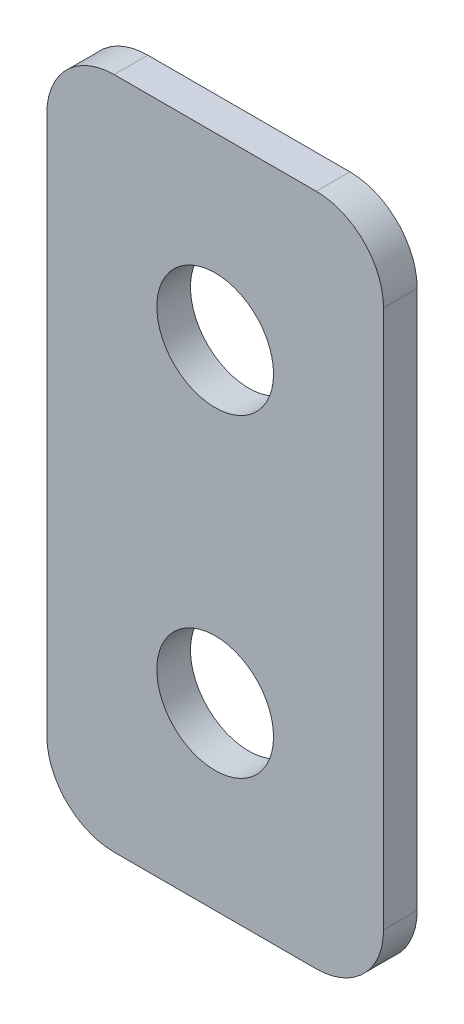
ISO-10303-21;
HEADER;
FILE_DESCRIPTION(('STEP AP214'),'2;1');
FILE_NAME('part.step','',(''),(''),'','','');
FILE_SCHEMA(('AUTOMOTIVE_DESIGN { 1 0 10303 214 1 1 1 1 }'));
ENDSEC;
DATA;
#1=APPLICATION_CONTEXT('core data for automotive mechanical design processes');
#2=APPLICATION_PROTOCOL_DEFINITION('international standard','automotive_design',2000,#1);
#3=PRODUCT_CONTEXT('',#1,'mechanical');
#4=PRODUCT('Part','Part','',(#3));
#5=PRODUCT_RELATED_PRODUCT_CATEGORY('part','',(#4));
#6=PRODUCT_DEFINITION_FORMATION('','',#4);
#7=PRODUCT_DEFINITION_CONTEXT('part definition',#1,'design');
#8=PRODUCT_DEFINITION('design','',#6,#7);
#9=PRODUCT_DEFINITION_SHAPE('','',#8);
#10=(LENGTH_UNIT() NAMED_UNIT(*) SI_UNIT(.MILLI.,.METRE.));
#11=(NAMED_UNIT(*) PLANE_ANGLE_UNIT() SI_UNIT($,.RADIAN.));
#12=(NAMED_UNIT(*) SI_UNIT($,.STERADIAN.) SOLID_ANGLE_UNIT());
#13=UNCERTAINTY_MEASURE_WITH_UNIT(LENGTH_MEASURE(1.E-05),#10,'distance_accuracy_value','');
#14=(GEOMETRIC_REPRESENTATION_CONTEXT(3) GLOBAL_UNCERTAINTY_ASSIGNED_CONTEXT((#13)) GLOBAL_UNIT_ASSIGNED_CONTEXT((#10,
#11,#12)) REPRESENTATION_CONTEXT('',''));
#15=CARTESIAN_POINT('',(0.,0.,0.));
#16=DIRECTION('',(0.,0.,1.));
#17=DIRECTION('',(1.,0.,0.));
#18=AXIS2_PLACEMENT_3D('',#15,#16,#17);
#19=CARTESIAN_POINT('',(12.,27.,0.));
#20=DIRECTION('',(0.,0.,1.));
#21=DIRECTION('',(1.,0.,0.));
#22=AXIS2_PLACEMENT_3D('',#19,#20,#21);
#23=CYLINDRICAL_SURFACE('',#22,3.);
#24=DIRECTION('',(0.,0.,1.));
#25=VECTOR('',#24,1.);
#26=CARTESIAN_POINT('',(15.,27.,0.));
#27=LINE('',#26,#25);
#28=CARTESIAN_POINT('',(15.,27.,-1.5));
#29=VERTEX_POINT('',#28);
#30=CARTESIAN_POINT('',(15.,27.,0.));
#31=VERTEX_POINT('',#30);
#32=EDGE_CURVE('E11',#29,#31,#27,.T.);
#33=ORIENTED_EDGE('',*,*,#32,.F.);
#34=CARTESIAN_POINT('',(12.,27.,-1.5));
#35=DIRECTION('',(0.,0.,1.));
#36=DIRECTION('',(1.,0.,0.));
#37=AXIS2_PLACEMENT_3D('',#34,#35,#36);
#38=CIRCLE('',#37,3.);
#39=CARTESIAN_POINT('',(12.,30.,-1.5));
#40=VERTEX_POINT('',#39);
#41=EDGE_CURVE('E107',#29,#40,#38,.T.);
#42=ORIENTED_EDGE('',*,*,#41,.T.);
#43=DIRECTION('',(0.,0.,1.));
#44=VECTOR('',#43,1.);
#45=CARTESIAN_POINT('',(12.,30.,0.));
#46=LINE('',#45,#44);
#47=CARTESIAN_POINT('',(12.,30.,0.));
#48=VERTEX_POINT('',#47);
#49=EDGE_CURVE('E50',#40,#48,#46,.T.);
#50=ORIENTED_EDGE('',*,*,#49,.T.);
#51=CARTESIAN_POINT('',(12.,27.,0.));
#52=DIRECTION('',(0.,0.,1.));
#53=DIRECTION('',(-1.,0.,0.));
#54=AXIS2_PLACEMENT_3D('',#51,#52,#53);
#55=CIRCLE('',#54,3.);
#56=EDGE_CURVE('E160',#31,#48,#55,.T.);
#57=ORIENTED_EDGE('',*,*,#56,.F.);
#58=EDGE_LOOP('',(#33,#42,#50,#57));
#59=FACE_BOUND('',#58,.T.);
#60=ADVANCED_FACE('F40',(#59),#23,.T.);
#61=CARTESIAN_POINT('',(3.00000000000002,30.,0.));
#62=DIRECTION('',(0.,1.,0.));
#63=DIRECTION('',(-1.,0.,0.));
#64=AXIS2_PLACEMENT_3D('',#61,#62,#63);
#65=PLANE('',#64);
#66=ORIENTED_EDGE('',*,*,#49,.F.);
#67=DIRECTION('',(1.,0.,0.));
#68=VECTOR('',#67,1.);
#69=CARTESIAN_POINT('',(12.,30.,-1.5));
#70=LINE('',#69,#68);
#71=CARTESIAN_POINT('',(3.00000000000002,30.,-1.5));
#72=VERTEX_POINT('',#71);
#73=EDGE_CURVE('E138',#40,#72,#70,.F.);
#74=ORIENTED_EDGE('',*,*,#73,.T.);
#75=DIRECTION('',(0.,0.,1.));
#76=VECTOR('',#75,1.);
#77=CARTESIAN_POINT('',(3.00000000000002,30.,0.));
#78=LINE('',#77,#76);
#79=CARTESIAN_POINT('',(3.00000000000002,30.,0.));
#80=VERTEX_POINT('',#79);
#81=EDGE_CURVE('E153',#72,#80,#78,.T.);
#82=ORIENTED_EDGE('',*,*,#81,.T.);
#83=DIRECTION('',(-1.,0.,0.));
#84=VECTOR('',#83,1.);
#85=CARTESIAN_POINT('',(3.00000000000002,30.,0.));
#86=LINE('',#85,#84);
#87=EDGE_CURVE('E169',#48,#80,#86,.T.);
#88=ORIENTED_EDGE('',*,*,#87,.F.);
#89=EDGE_LOOP('',(#66,#74,#82,#88));
#90=FACE_BOUND('',#89,.T.);
#91=ADVANCED_FACE('F173',(#90),#65,.T.);
#92=CARTESIAN_POINT('',(3.,27.,0.));
#93=DIRECTION('',(0.,0.,1.));
#94=DIRECTION('',(1.,0.,0.));
#95=AXIS2_PLACEMENT_3D('',#92,#93,#94);
#96=CYLINDRICAL_SURFACE('',#95,3.);
#97=ORIENTED_EDGE('',*,*,#81,.F.);
#98=CARTESIAN_POINT('',(3.,27.,-1.5));
#99=DIRECTION('',(0.,0.,1.));
#100=DIRECTION('',(1.,0.,0.));
#101=AXIS2_PLACEMENT_3D('',#98,#99,#100);
#102=CIRCLE('',#101,3.);
#103=CARTESIAN_POINT('',(0.,27.,-1.5));
#104=VERTEX_POINT('',#103);
#105=EDGE_CURVE('E134',#72,#104,#102,.T.);
#106=ORIENTED_EDGE('',*,*,#105,.T.);
#107=DIRECTION('',(0.,0.,1.));
#108=VECTOR('',#107,1.);
#109=CARTESIAN_POINT('',(0.,27.,0.));
#110=LINE('',#109,#108);
#111=CARTESIAN_POINT('',(0.,27.,0.));
#112=VERTEX_POINT('',#111);
#113=EDGE_CURVE('E150',#104,#112,#110,.T.);
#114=ORIENTED_EDGE('',*,*,#113,.T.);
#115=CARTESIAN_POINT('',(3.,27.,0.));
#116=DIRECTION('',(0.,0.,1.));
#117=DIRECTION('',(-1.,0.,0.));
#118=AXIS2_PLACEMENT_3D('',#115,#116,#117);
#119=CIRCLE('',#118,3.);
#120=EDGE_CURVE('E175',#80,#112,#119,.T.);
#121=ORIENTED_EDGE('',*,*,#120,.F.);
#122=EDGE_LOOP('',(#97,#106,#114,#121));
#123=FACE_BOUND('',#122,.T.);
#124=ADVANCED_FACE('F220',(#123),#96,.T.);
#125=CARTESIAN_POINT('',(0.,3.00000000000002,0.));
#126=DIRECTION('',(-1.,0.,0.));
#127=DIRECTION('',(0.,-1.,0.));
#128=AXIS2_PLACEMENT_3D('',#125,#126,#127);
#129=PLANE('',#128);
#130=ORIENTED_EDGE('',*,*,#113,.F.);
#131=DIRECTION('',(0.,1.,0.));
#132=VECTOR('',#131,1.);
#133=CARTESIAN_POINT('',(0.,3.,-1.5));
#134=LINE('',#133,#132);
#135=CARTESIAN_POINT('',(0.,3.,-1.5));
#136=VERTEX_POINT('',#135);
#137=EDGE_CURVE('E130',#104,#136,#134,.F.);
#138=ORIENTED_EDGE('',*,*,#137,.T.);
#139=DIRECTION('',(0.,0.,1.));
#140=VECTOR('',#139,1.);
#141=CARTESIAN_POINT('',(0.,3.,0.));
#142=LINE('',#141,#140);
#143=CARTESIAN_POINT('',(0.,3.,0.));
#144=VERTEX_POINT('',#143);
#145=EDGE_CURVE('E147',#136,#144,#142,.T.);
#146=ORIENTED_EDGE('',*,*,#145,.T.);
#147=DIRECTION('',(0.,-1.,0.));
#148=VECTOR('',#147,1.);
#149=CARTESIAN_POINT('',(0.,3.00000000000002,0.));
#150=LINE('',#149,#148);
#151=EDGE_CURVE('E180',#112,#144,#150,.T.);
#152=ORIENTED_EDGE('',*,*,#151,.F.);
#153=EDGE_LOOP('',(#130,#138,#146,#152));
#154=FACE_BOUND('',#153,.T.);
#155=ADVANCED_FACE('F225',(#154),#129,.T.);
#156=CARTESIAN_POINT('',(3.,3.,0.));
#157=DIRECTION('',(0.,0.,1.));
#158=DIRECTION('',(1.,0.,0.));
#159=AXIS2_PLACEMENT_3D('',#156,#157,#158);
#160=CYLINDRICAL_SURFACE('',#159,3.);
#161=ORIENTED_EDGE('',*,*,#145,.F.);
#162=CARTESIAN_POINT('',(3.,3.,-1.5));
#163=DIRECTION('',(0.,0.,1.));
#164=DIRECTION('',(1.,0.,0.));
#165=AXIS2_PLACEMENT_3D('',#162,#163,#164);
#166=CIRCLE('',#165,3.);
#167=CARTESIAN_POINT('',(3.00000000000002,0.,-1.5));
#168=VERTEX_POINT('',#167);
#169=EDGE_CURVE('E126',#136,#168,#166,.T.);
#170=ORIENTED_EDGE('',*,*,#169,.T.);
#171=DIRECTION('',(0.,0.,1.));
#172=VECTOR('',#171,1.);
#173=CARTESIAN_POINT('',(3.00000000000002,0.,0.));
#174=LINE('',#173,#172);
#175=CARTESIAN_POINT('',(3.00000000000002,0.,0.));
#176=VERTEX_POINT('',#175);
#177=EDGE_CURVE('E145',#168,#176,#174,.T.);
#178=ORIENTED_EDGE('',*,*,#177,.T.);
#179=CARTESIAN_POINT('',(3.,3.,0.));
#180=DIRECTION('',(0.,0.,1.));
#181=DIRECTION('',(-1.,0.,0.));
#182=AXIS2_PLACEMENT_3D('',#179,#180,#181);
#183=CIRCLE('',#182,3.);
#184=EDGE_CURVE('E187',#144,#176,#183,.T.);
#185=ORIENTED_EDGE('',*,*,#184,.F.);
#186=EDGE_LOOP('',(#161,#170,#178,#185));
#187=FACE_BOUND('',#186,.T.);
#188=ADVANCED_FACE('F229',(#187),#160,.T.);
#189=CARTESIAN_POINT('',(3.00000000000002,0.,0.));
#190=DIRECTION('',(0.,-1.,0.));
#191=DIRECTION('',(1.,0.,0.));
#192=AXIS2_PLACEMENT_3D('',#189,#190,#191);
#193=PLANE('',#192);
#194=ORIENTED_EDGE('',*,*,#177,.F.);
#195=DIRECTION('',(1.,0.,0.));
#196=VECTOR('',#195,1.);
#197=CARTESIAN_POINT('',(12.,0.,-1.5));
#198=LINE('',#197,#196);
#199=CARTESIAN_POINT('',(12.,0.,-1.5));
#200=VERTEX_POINT('',#199);
#201=EDGE_CURVE('E122',#168,#200,#198,.T.);
#202=ORIENTED_EDGE('',*,*,#201,.T.);
#203=DIRECTION('',(0.,0.,1.));
#204=VECTOR('',#203,1.);
#205=CARTESIAN_POINT('',(12.,0.,0.));
#206=LINE('',#205,#204);
#207=CARTESIAN_POINT('',(12.,0.,0.));
#208=VERTEX_POINT('',#207);
#209=EDGE_CURVE('E58',#200,#208,#206,.T.);
#210=ORIENTED_EDGE('',*,*,#209,.T.);
#211=DIRECTION('',(1.,0.,0.));
#212=VECTOR('',#211,1.);
#213=CARTESIAN_POINT('',(3.00000000000002,0.,0.));
#214=LINE('',#213,#212);
#215=EDGE_CURVE('E100',#176,#208,#214,.T.);
#216=ORIENTED_EDGE('',*,*,#215,.F.);
#217=EDGE_LOOP('',(#194,#202,#210,#216));
#218=FACE_BOUND('',#217,.T.);
#219=ADVANCED_FACE('F212',(#218),#193,.T.);
#220=CARTESIAN_POINT('',(12.,3.,0.));
#221=DIRECTION('',(0.,0.,1.));
#222=DIRECTION('',(1.,0.,0.));
#223=AXIS2_PLACEMENT_3D('',#220,#221,#222);
#224=CYLINDRICAL_SURFACE('',#223,3.);
#225=ORIENTED_EDGE('',*,*,#209,.F.);
#226=CARTESIAN_POINT('',(12.,3.,-1.5));
#227=DIRECTION('',(0.,0.,1.));
#228=DIRECTION('',(1.,0.,0.));
#229=AXIS2_PLACEMENT_3D('',#226,#227,#228);
#230=CIRCLE('',#229,3.);
#231=CARTESIAN_POINT('',(15.,3.00000000000002,-1.5));
#232=VERTEX_POINT('',#231);
#233=EDGE_CURVE('E105',#200,#232,#230,.T.);
#234=ORIENTED_EDGE('',*,*,#233,.T.);
#235=DIRECTION('',(0.,0.,1.));
#236=VECTOR('',#235,1.);
#237=CARTESIAN_POINT('',(15.,3.00000000000002,0.));
#238=LINE('',#237,#236);
#239=CARTESIAN_POINT('',(15.,3.00000000000002,0.));
#240=VERTEX_POINT('',#239);
#241=EDGE_CURVE('E44',#232,#240,#238,.T.);
#242=ORIENTED_EDGE('',*,*,#241,.T.);
#243=CARTESIAN_POINT('',(12.,3.,0.));
#244=DIRECTION('',(0.,0.,1.));
#245=DIRECTION('',(1.,0.,0.));
#246=AXIS2_PLACEMENT_3D('',#243,#244,#245);
#247=CIRCLE('',#246,3.);
#248=EDGE_CURVE('E247',#208,#240,#247,.T.);
#249=ORIENTED_EDGE('',*,*,#248,.F.);
#250=EDGE_LOOP('',(#225,#234,#242,#249));
#251=FACE_BOUND('',#250,.T.);
#252=ADVANCED_FACE('F110',(#251),#224,.T.);
#253=CARTESIAN_POINT('',(7.5,22.,0.));
#254=DIRECTION('',(0.,0.,1.));
#255=DIRECTION('',(1.,0.,0.));
#256=AXIS2_PLACEMENT_3D('',#253,#254,#255);
#257=CYLINDRICAL_SURFACE('',#256,2.59999999999999);
#258=CARTESIAN_POINT('',(7.5,22.,0.));
#259=DIRECTION('',(0.,0.,1.));
#260=DIRECTION('',(1.,0.,0.));
#261=AXIS2_PLACEMENT_3D('',#258,#259,#260);
#262=CIRCLE('',#261,2.59999999999999);
#263=CARTESIAN_POINT('',(10.1,22.,0.));
#264=VERTEX_POINT('',#263);
#265=EDGE_CURVE('E125',#264,#264,#262,.T.);
#266=ORIENTED_EDGE('',*,*,#265,.T.);
#267=EDGE_LOOP('',(#266));
#268=FACE_BOUND('',#267,.T.);
#269=CARTESIAN_POINT('',(7.5,22.,-1.5));
#270=DIRECTION('',(0.,0.,1.));
#271=DIRECTION('',(1.,0.,0.));
#272=AXIS2_PLACEMENT_3D('',#269,#270,#271);
#273=CIRCLE('',#272,2.59999999999999);
#274=CARTESIAN_POINT('',(10.1,22.,-1.5));
#275=VERTEX_POINT('',#274);
#276=EDGE_CURVE('E118',#275,#275,#273,.T.);
#277=ORIENTED_EDGE('',*,*,#276,.F.);
#278=EDGE_LOOP('',(#277));
#279=FACE_BOUND('',#278,.T.);
#280=ADVANCED_FACE('F201',(#268,#279),#257,.F.);
#281=CARTESIAN_POINT('',(7.5,8.,0.));
#282=DIRECTION('',(0.,0.,1.));
#283=DIRECTION('',(1.,0.,0.));
#284=AXIS2_PLACEMENT_3D('',#281,#282,#283);
#285=CYLINDRICAL_SURFACE('',#284,2.6);
#286=CARTESIAN_POINT('',(7.5,8.,0.));
#287=DIRECTION('',(0.,0.,1.));
#288=DIRECTION('',(1.,0.,0.));
#289=AXIS2_PLACEMENT_3D('',#286,#287,#288);
#290=CIRCLE('',#289,2.6);
#291=CARTESIAN_POINT('',(10.1,8.,0.));
#292=VERTEX_POINT('',#291);
#293=EDGE_CURVE('E249',#292,#292,#290,.T.);
#294=ORIENTED_EDGE('',*,*,#293,.T.);
#295=EDGE_LOOP('',(#294));
#296=FACE_BOUND('',#295,.T.);
#297=CARTESIAN_POINT('',(7.5,8.,-1.5));
#298=DIRECTION('',(0.,0.,1.));
#299=DIRECTION('',(1.,0.,0.));
#300=AXIS2_PLACEMENT_3D('',#297,#298,#299);
#301=CIRCLE('',#300,2.6);
#302=CARTESIAN_POINT('',(10.1,8.,-1.5));
#303=VERTEX_POINT('',#302);
#304=EDGE_CURVE('E112',#303,#303,#301,.T.);
#305=ORIENTED_EDGE('',*,*,#304,.F.);
#306=EDGE_LOOP('',(#305));
#307=FACE_BOUND('',#306,.T.);
#308=ADVANCED_FACE('F203',(#296,#307),#285,.F.);
#309=CARTESIAN_POINT('',(15.,3.00000000000002,0.));
#310=DIRECTION('',(1.,0.,0.));
#311=DIRECTION('',(0.,1.,0.));
#312=AXIS2_PLACEMENT_3D('',#309,#310,#311);
#313=PLANE('',#312);
#314=DIRECTION('',(0.,1.,0.));
#315=VECTOR('',#314,1.);
#316=CARTESIAN_POINT('',(15.,3.,-1.5));
#317=LINE('',#316,#315);
#318=EDGE_CURVE('E94',#232,#29,#317,.T.);
#319=ORIENTED_EDGE('',*,*,#318,.T.);
#320=ORIENTED_EDGE('',*,*,#32,.T.);
#321=DIRECTION('',(0.,1.,0.));
#322=VECTOR('',#321,1.);
#323=CARTESIAN_POINT('',(15.,3.00000000000002,0.));
#324=LINE('',#323,#322);
#325=EDGE_CURVE('E96',#240,#31,#324,.T.);
#326=ORIENTED_EDGE('',*,*,#325,.F.);
#327=ORIENTED_EDGE('',*,*,#241,.F.);
#328=EDGE_LOOP('',(#319,#320,#326,#327));
#329=FACE_BOUND('',#328,.T.);
#330=ADVANCED_FACE('F42',(#329),#313,.T.);
#331=CARTESIAN_POINT('',(12.,3.,0.));
#332=DIRECTION('',(0.,0.,1.));
#333=DIRECTION('',(1.,0.,0.));
#334=AXIS2_PLACEMENT_3D('',#331,#332,#333);
#335=PLANE('',#334);
#336=ORIENTED_EDGE('',*,*,#265,.F.);
#337=EDGE_LOOP('',(#336));
#338=FACE_BOUND('',#337,.T.);
#339=ORIENTED_EDGE('',*,*,#293,.F.);
#340=EDGE_LOOP('',(#339));
#341=FACE_BOUND('',#340,.T.);
#342=ORIENTED_EDGE('',*,*,#248,.T.);
#343=ORIENTED_EDGE('',*,*,#325,.T.);
#344=ORIENTED_EDGE('',*,*,#56,.T.);
#345=ORIENTED_EDGE('',*,*,#87,.T.);
#346=ORIENTED_EDGE('',*,*,#120,.T.);
#347=ORIENTED_EDGE('',*,*,#151,.T.);
#348=ORIENTED_EDGE('',*,*,#184,.T.);
#349=ORIENTED_EDGE('',*,*,#215,.T.);
#350=EDGE_LOOP('',(#342,#343,#344,#345,#346,#347,#348,#349));
#351=FACE_BOUND('',#350,.T.);
#352=ADVANCED_FACE('F167',(#338,#341,#351),#335,.T.);
#353=CARTESIAN_POINT('',(12.,3.,-1.5));
#354=DIRECTION('',(0.,0.,1.));
#355=DIRECTION('',(1.,0.,0.));
#356=AXIS2_PLACEMENT_3D('',#353,#354,#355);
#357=PLANE('',#356);
#358=ORIENTED_EDGE('',*,*,#276,.T.);
#359=EDGE_LOOP('',(#358));
#360=FACE_BOUND('',#359,.T.);
#361=ORIENTED_EDGE('',*,*,#304,.T.);
#362=EDGE_LOOP('',(#361));
#363=FACE_BOUND('',#362,.T.);
#364=ORIENTED_EDGE('',*,*,#233,.F.);
#365=ORIENTED_EDGE('',*,*,#201,.F.);
#366=ORIENTED_EDGE('',*,*,#169,.F.);
#367=ORIENTED_EDGE('',*,*,#137,.F.);
#368=ORIENTED_EDGE('',*,*,#105,.F.);
#369=ORIENTED_EDGE('',*,*,#73,.F.);
#370=ORIENTED_EDGE('',*,*,#41,.F.);
#371=ORIENTED_EDGE('',*,*,#318,.F.);
#372=EDGE_LOOP('',(#364,#365,#366,#367,#368,#369,#370,#371));
#373=FACE_BOUND('',#372,.T.);
#374=ADVANCED_FACE('F103',(#360,#363,#373),#357,.F.);
#375=CLOSED_SHELL('',(#60,#91,#124,#155,#188,#219,#252,#280,#308,#330,#352,#374));
#376=MANIFOLD_SOLID_BREP('B2',#375);
#377=ADVANCED_BREP_SHAPE_REPRESENTATION('',(#18,#376),#14);
#378=SHAPE_DEFINITION_REPRESENTATION(#9,#377);
ENDSEC;
END-ISO-10303-21;
